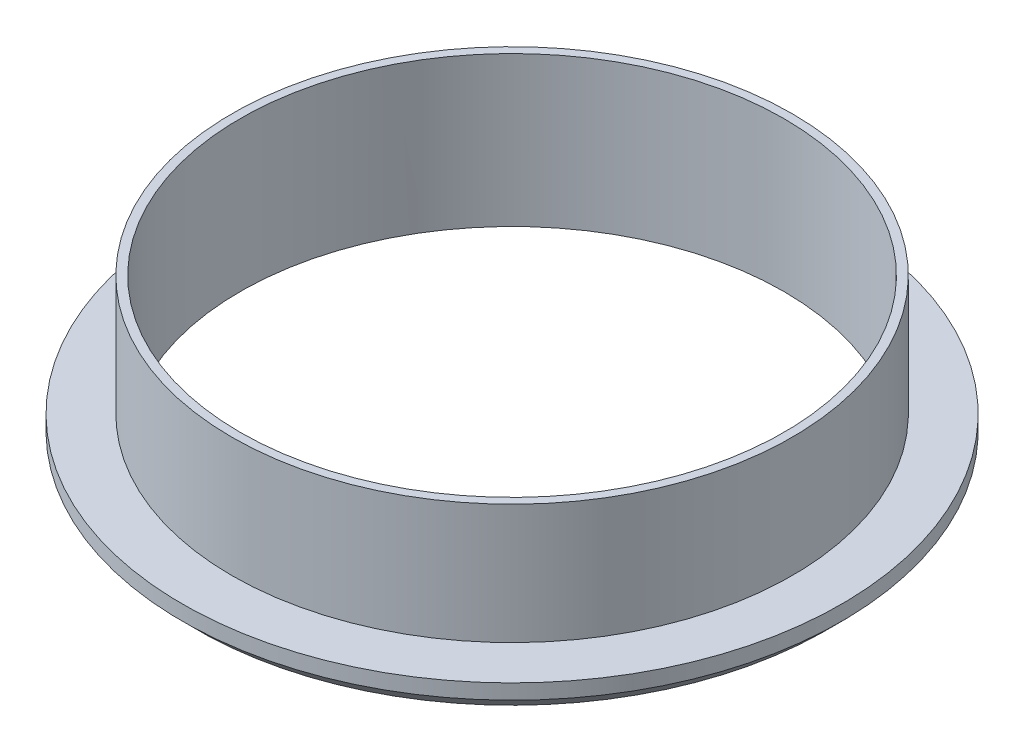
ISO-10303-21;
HEADER;
FILE_DESCRIPTION(('STEP AP214'),'2;1');
FILE_NAME('part.step','',(''),(''),'','','');
FILE_SCHEMA(('AUTOMOTIVE_DESIGN { 1 0 10303 214 1 1 1 1 }'));
ENDSEC;
DATA;
#1=APPLICATION_CONTEXT('core data for automotive mechanical design processes');
#2=APPLICATION_PROTOCOL_DEFINITION('international standard','automotive_design',2000,#1);
#3=PRODUCT_CONTEXT('',#1,'mechanical');
#4=PRODUCT('Part','Part','',(#3));
#5=PRODUCT_RELATED_PRODUCT_CATEGORY('part','',(#4));
#6=PRODUCT_DEFINITION_FORMATION('','',#4);
#7=PRODUCT_DEFINITION_CONTEXT('part definition',#1,'design');
#8=PRODUCT_DEFINITION('design','',#6,#7);
#9=PRODUCT_DEFINITION_SHAPE('','',#8);
#10=(LENGTH_UNIT() NAMED_UNIT(*) SI_UNIT(.MILLI.,.METRE.));
#11=(NAMED_UNIT(*) PLANE_ANGLE_UNIT() SI_UNIT($,.RADIAN.));
#12=(NAMED_UNIT(*) SI_UNIT($,.STERADIAN.) SOLID_ANGLE_UNIT());
#13=UNCERTAINTY_MEASURE_WITH_UNIT(LENGTH_MEASURE(1.E-05),#10,'distance_accuracy_value','');
#14=(GEOMETRIC_REPRESENTATION_CONTEXT(3) GLOBAL_UNCERTAINTY_ASSIGNED_CONTEXT((#13)) GLOBAL_UNIT_ASSIGNED_CONTEXT((#10,
#11,#12)) REPRESENTATION_CONTEXT('',''));
#15=CARTESIAN_POINT('',(0.,0.,0.));
#16=DIRECTION('',(0.,0.,1.));
#17=DIRECTION('',(1.,0.,0.));
#18=AXIS2_PLACEMENT_3D('',#15,#16,#17);
#19=CARTESIAN_POINT('',(0.,6.35,0.));
#20=DIRECTION('',(0.,1.,0.));
#21=DIRECTION('',(0.,0.,1.));
#22=AXIS2_PLACEMENT_3D('',#19,#20,#21);
#23=PLANE('',#22);
#24=CARTESIAN_POINT('',(0.,6.35,0.));
#25=DIRECTION('',(0.,1.,0.));
#26=DIRECTION('',(0.,0.,1.));
#27=AXIS2_PLACEMENT_3D('',#24,#25,#26);
#28=CIRCLE('',#27,14.8463);
#29=CARTESIAN_POINT('',(0.,6.35,14.8463));
#30=VERTEX_POINT('',#29);
#31=EDGE_CURVE('E50',#30,#30,#28,.T.);
#32=ORIENTED_EDGE('',*,*,#31,.T.);
#33=EDGE_LOOP('',(#32));
#34=FACE_BOUND('',#33,.T.);
#35=CARTESIAN_POINT('',(0.,6.35,0.));
#36=DIRECTION('',(0.,1.,0.));
#37=DIRECTION('',(0.,0.,1.));
#38=AXIS2_PLACEMENT_3D('',#35,#36,#37);
#39=CIRCLE('',#38,14.4018);
#40=CARTESIAN_POINT('',(0.,6.35,14.4018));
#41=VERTEX_POINT('',#40);
#42=EDGE_CURVE('E55',#41,#41,#39,.T.);
#43=ORIENTED_EDGE('',*,*,#42,.F.);
#44=EDGE_LOOP('',(#43));
#45=FACE_BOUND('',#44,.T.);
#46=ADVANCED_FACE('F37',(#34,#45),#23,.T.);
#47=CARTESIAN_POINT('',(0.,6.35,0.));
#48=DIRECTION('',(0.,-1.,0.));
#49=DIRECTION('',(0.,0.,-1.));
#50=AXIS2_PLACEMENT_3D('',#47,#48,#49);
#51=CYLINDRICAL_SURFACE('',#50,14.8463);
#52=ORIENTED_EDGE('',*,*,#31,.F.);
#53=EDGE_LOOP('',(#52));
#54=FACE_BOUND('',#53,.T.);
#55=CARTESIAN_POINT('',(0.,0.,0.));
#56=DIRECTION('',(0.,1.,0.));
#57=DIRECTION('',(0.,0.,1.));
#58=AXIS2_PLACEMENT_3D('',#55,#56,#57);
#59=CIRCLE('',#58,14.8463);
#60=CARTESIAN_POINT('',(0.,0.,14.8463));
#61=VERTEX_POINT('',#60);
#62=EDGE_CURVE('E58',#61,#61,#59,.T.);
#63=ORIENTED_EDGE('',*,*,#62,.T.);
#64=EDGE_LOOP('',(#63));
#65=FACE_BOUND('',#64,.T.);
#66=ADVANCED_FACE('F87',(#54,#65),#51,.T.);
#67=CARTESIAN_POINT('',(0.,6.35,0.));
#68=DIRECTION('',(0.,-1.,0.));
#69=DIRECTION('',(0.,0.,-1.));
#70=AXIS2_PLACEMENT_3D('',#67,#68,#69);
#71=CYLINDRICAL_SURFACE('',#70,14.4018);
#72=ORIENTED_EDGE('',*,*,#42,.T.);
#73=EDGE_LOOP('',(#72));
#74=FACE_BOUND('',#73,.T.);
#75=CARTESIAN_POINT('',(0.,-1.5875,0.));
#76=DIRECTION('',(0.,-1.,0.));
#77=DIRECTION('',(0.,0.,-1.));
#78=AXIS2_PLACEMENT_3D('',#75,#76,#77);
#79=CIRCLE('',#78,14.4018);
#80=CARTESIAN_POINT('',(0.,-1.5875,-14.4018));
#81=VERTEX_POINT('',#80);
#82=EDGE_CURVE('E69',#81,#81,#79,.T.);
#83=ORIENTED_EDGE('',*,*,#82,.T.);
#84=EDGE_LOOP('',(#83));
#85=FACE_BOUND('',#84,.T.);
#86=ADVANCED_FACE('F74',(#74,#85),#71,.F.);
#87=CARTESIAN_POINT('',(0.,-1.5875,0.));
#88=DIRECTION('',(0.,-1.,0.));
#89=DIRECTION('',(0.,0.,-1.));
#90=AXIS2_PLACEMENT_3D('',#87,#88,#89);
#91=PLANE('',#90);
#92=CARTESIAN_POINT('',(0.,-1.5875,0.));
#93=DIRECTION('',(0.,-1.,0.));
#94=DIRECTION('',(0.,0.,-1.));
#95=AXIS2_PLACEMENT_3D('',#92,#93,#94);
#96=CIRCLE('',#95,16.66875);
#97=CARTESIAN_POINT('',(0.,-1.5875,-16.66875));
#98=VERTEX_POINT('',#97);
#99=EDGE_CURVE('E45',#98,#98,#96,.T.);
#100=ORIENTED_EDGE('',*,*,#99,.T.);
#101=EDGE_LOOP('',(#100));
#102=FACE_BOUND('',#101,.T.);
#103=ORIENTED_EDGE('',*,*,#82,.F.);
#104=EDGE_LOOP('',(#103));
#105=FACE_BOUND('',#104,.T.);
#106=ADVANCED_FACE('F76',(#102,#105),#91,.T.);
#107=CARTESIAN_POINT('',(0.,0.,0.));
#108=DIRECTION('',(0.,-1.,0.));
#109=DIRECTION('',(0.,0.,-1.));
#110=AXIS2_PLACEMENT_3D('',#107,#108,#109);
#111=PLANE('',#110);
#112=ORIENTED_EDGE('',*,*,#62,.F.);
#113=EDGE_LOOP('',(#112));
#114=FACE_BOUND('',#113,.T.);
#115=CARTESIAN_POINT('',(0.,0.,0.));
#116=DIRECTION('',(0.,-1.,0.));
#117=DIRECTION('',(0.,0.,-1.));
#118=AXIS2_PLACEMENT_3D('',#115,#116,#117);
#119=CIRCLE('',#118,17.4625);
#120=CARTESIAN_POINT('',(0.,0.,-17.4625));
#121=VERTEX_POINT('',#120);
#122=EDGE_CURVE('E61',#121,#121,#119,.T.);
#123=ORIENTED_EDGE('',*,*,#122,.F.);
#124=EDGE_LOOP('',(#123));
#125=FACE_BOUND('',#124,.T.);
#126=ADVANCED_FACE('F78',(#114,#125),#111,.F.);
#127=CARTESIAN_POINT('',(0.,-1.5875,0.));
#128=DIRECTION('',(0.,1.,0.));
#129=DIRECTION('',(0.,0.,1.));
#130=AXIS2_PLACEMENT_3D('',#127,#128,#129);
#131=CYLINDRICAL_SURFACE('',#130,17.4625);
#132=CARTESIAN_POINT('',(0.,-0.793750000000001,0.));
#133=DIRECTION('',(0.,-1.,0.));
#134=DIRECTION('',(0.,0.,-1.));
#135=AXIS2_PLACEMENT_3D('',#132,#133,#134);
#136=CIRCLE('',#135,17.4625);
#137=CARTESIAN_POINT('',(0.,-0.793750000000001,-17.4625));
#138=VERTEX_POINT('',#137);
#139=EDGE_CURVE('E10',#138,#138,#136,.F.);
#140=ORIENTED_EDGE('',*,*,#139,.T.);
#141=EDGE_LOOP('',(#140));
#142=FACE_BOUND('',#141,.T.);
#143=ORIENTED_EDGE('',*,*,#122,.T.);
#144=EDGE_LOOP('',(#143));
#145=FACE_BOUND('',#144,.T.);
#146=ADVANCED_FACE('F84',(#142,#145),#131,.T.);
#147=CARTESIAN_POINT('',(0.,-1.5875,0.));
#148=DIRECTION('',(0.,1.,0.));
#149=DIRECTION('',(0.,0.,1.));
#150=AXIS2_PLACEMENT_3D('',#147,#148,#149);
#151=CONICAL_SURFACE('',#150,16.66875,0.785398163397446);
#152=ORIENTED_EDGE('',*,*,#139,.F.);
#153=EDGE_LOOP('',(#152));
#154=FACE_BOUND('',#153,.T.);
#155=ORIENTED_EDGE('',*,*,#99,.F.);
#156=EDGE_LOOP('',(#155));
#157=FACE_BOUND('',#156,.T.);
#158=ADVANCED_FACE('F39',(#154,#157),#151,.T.);
#159=CLOSED_SHELL('',(#46,#66,#86,#106,#126,#146,#158));
#160=MANIFOLD_SOLID_BREP('B2',#159);
#161=ADVANCED_BREP_SHAPE_REPRESENTATION('',(#18,#160),#14);
#162=SHAPE_DEFINITION_REPRESENTATION(#9,#161);
ENDSEC;
END-ISO-10303-21;
